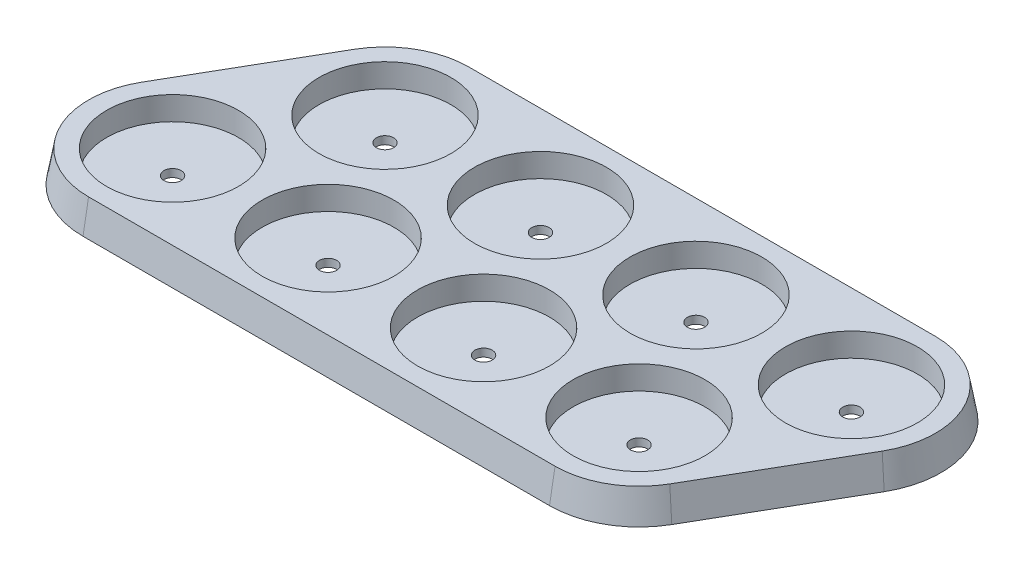
ISO-10303-21;
HEADER;
FILE_DESCRIPTION(('STEP AP214'),'2;1');
FILE_NAME('part.step','',(''),(''),'','','');
FILE_SCHEMA(('AUTOMOTIVE_DESIGN { 1 0 10303 214 1 1 1 1 }'));
ENDSEC;
DATA;
#1=APPLICATION_CONTEXT('core data for automotive mechanical design processes');
#2=APPLICATION_PROTOCOL_DEFINITION('international standard','automotive_design',2000,#1);
#3=PRODUCT_CONTEXT('',#1,'mechanical');
#4=PRODUCT('Part','Part','',(#3));
#5=PRODUCT_RELATED_PRODUCT_CATEGORY('part','',(#4));
#6=PRODUCT_DEFINITION_FORMATION('','',#4);
#7=PRODUCT_DEFINITION_CONTEXT('part definition',#1,'design');
#8=PRODUCT_DEFINITION('design','',#6,#7);
#9=PRODUCT_DEFINITION_SHAPE('','',#8);
#10=(LENGTH_UNIT() NAMED_UNIT(*) SI_UNIT(.MILLI.,.METRE.));
#11=(NAMED_UNIT(*) PLANE_ANGLE_UNIT() SI_UNIT($,.RADIAN.));
#12=(NAMED_UNIT(*) SI_UNIT($,.STERADIAN.) SOLID_ANGLE_UNIT());
#13=UNCERTAINTY_MEASURE_WITH_UNIT(LENGTH_MEASURE(1.E-05),#10,'distance_accuracy_value','');
#14=(GEOMETRIC_REPRESENTATION_CONTEXT(3) GLOBAL_UNCERTAINTY_ASSIGNED_CONTEXT((#13)) GLOBAL_UNIT_ASSIGNED_CONTEXT((#10,
#11,#12)) REPRESENTATION_CONTEXT('',''));
#15=CARTESIAN_POINT('',(0.,0.,0.));
#16=DIRECTION('',(0.,0.,1.));
#17=DIRECTION('',(1.,0.,0.));
#18=AXIS2_PLACEMENT_3D('',#15,#16,#17);
#19=CARTESIAN_POINT('',(-9.90000000000008,0.,17.1473029949318));
#20=DIRECTION('',(0.,1.,0.));
#21=DIRECTION('',(0.,0.,1.));
#22=AXIS2_PLACEMENT_3D('',#19,#20,#21);
#23=CYLINDRICAL_SURFACE('',#22,1.1);
#24=CARTESIAN_POINT('',(-9.90000000000008,0.,17.1473029949318));
#25=DIRECTION('',(0.,1.,0.));
#26=DIRECTION('',(0.,0.,1.));
#27=AXIS2_PLACEMENT_3D('',#24,#25,#26);
#28=CIRCLE('',#27,1.1);
#29=CARTESIAN_POINT('',(-9.90000000000008,0.,18.2473029949318));
#30=VERTEX_POINT('',#29);
#31=EDGE_CURVE('E204',#30,#30,#28,.T.);
#32=ORIENTED_EDGE('',*,*,#31,.F.);
#33=EDGE_LOOP('',(#32));
#34=FACE_BOUND('',#33,.T.);
#35=CARTESIAN_POINT('',(-9.90000000000008,1.,17.1473029949318));
#36=DIRECTION('',(0.,1.,0.));
#37=DIRECTION('',(0.,0.,1.));
#38=AXIS2_PLACEMENT_3D('',#35,#36,#37);
#39=CIRCLE('',#38,1.1);
#40=CARTESIAN_POINT('',(-9.90000000000008,1.,18.2473029949318));
#41=VERTEX_POINT('',#40);
#42=EDGE_CURVE('E717',#41,#41,#39,.T.);
#43=ORIENTED_EDGE('',*,*,#42,.T.);
#44=EDGE_LOOP('',(#43));
#45=FACE_BOUND('',#44,.T.);
#46=ADVANCED_FACE('F116',(#34,#45),#23,.F.);
#47=CARTESIAN_POINT('',(-19.7999999999998,0.,0.));
#48=DIRECTION('',(0.,1.,0.));
#49=DIRECTION('',(0.,0.,1.));
#50=AXIS2_PLACEMENT_3D('',#47,#48,#49);
#51=CYLINDRICAL_SURFACE('',#50,1.1);
#52=CARTESIAN_POINT('',(-19.7999999999998,0.,0.));
#53=DIRECTION('',(0.,1.,0.));
#54=DIRECTION('',(0.,0.,1.));
#55=AXIS2_PLACEMENT_3D('',#52,#53,#54);
#56=CIRCLE('',#55,1.1);
#57=CARTESIAN_POINT('',(-19.7999999999998,0.,1.1));
#58=VERTEX_POINT('',#57);
#59=EDGE_CURVE('E749',#58,#58,#56,.T.);
#60=ORIENTED_EDGE('',*,*,#59,.F.);
#61=EDGE_LOOP('',(#60));
#62=FACE_BOUND('',#61,.T.);
#63=CARTESIAN_POINT('',(-19.7999999999998,1.,0.));
#64=DIRECTION('',(0.,1.,0.));
#65=DIRECTION('',(0.,0.,1.));
#66=AXIS2_PLACEMENT_3D('',#63,#64,#65);
#67=CIRCLE('',#66,1.1);
#68=CARTESIAN_POINT('',(-19.7999999999998,1.,1.1));
#69=VERTEX_POINT('',#68);
#70=EDGE_CURVE('E739',#69,#69,#67,.T.);
#71=ORIENTED_EDGE('',*,*,#70,.T.);
#72=EDGE_LOOP('',(#71));
#73=FACE_BOUND('',#72,.T.);
#74=ADVANCED_FACE('F299',(#62,#73),#51,.F.);
#75=CARTESIAN_POINT('',(-69.3000000000001,0.,17.1473029949314));
#76=DIRECTION('',(0.,1.,0.));
#77=DIRECTION('',(0.,0.,1.));
#78=AXIS2_PLACEMENT_3D('',#75,#76,#77);
#79=CYLINDRICAL_SURFACE('',#78,1.09999999999992);
#80=CARTESIAN_POINT('',(-69.3000000000001,0.,17.1473029949314));
#81=DIRECTION('',(0.,1.,0.));
#82=DIRECTION('',(0.,0.,1.));
#83=AXIS2_PLACEMENT_3D('',#80,#81,#82);
#84=CIRCLE('',#83,1.09999999999992);
#85=CARTESIAN_POINT('',(-69.3000000000001,0.,18.2473029949313));
#86=VERTEX_POINT('',#85);
#87=EDGE_CURVE('E758',#86,#86,#84,.T.);
#88=ORIENTED_EDGE('',*,*,#87,.F.);
#89=EDGE_LOOP('',(#88));
#90=FACE_BOUND('',#89,.T.);
#91=CARTESIAN_POINT('',(-69.3000000000001,1.,17.1473029949314));
#92=DIRECTION('',(0.,1.,0.));
#93=DIRECTION('',(0.,0.,1.));
#94=AXIS2_PLACEMENT_3D('',#91,#92,#93);
#95=CIRCLE('',#94,1.09999999999992);
#96=CARTESIAN_POINT('',(-69.3000000000001,1.,18.2473029949313));
#97=VERTEX_POINT('',#96);
#98=EDGE_CURVE('E839',#97,#97,#95,.T.);
#99=ORIENTED_EDGE('',*,*,#98,.T.);
#100=EDGE_LOOP('',(#99));
#101=FACE_BOUND('',#100,.T.);
#102=ADVANCED_FACE('F305',(#90,#101),#79,.F.);
#103=CARTESIAN_POINT('',(-59.3999999999999,0.,-5.575290229487E-13));
#104=DIRECTION('',(0.,1.,0.));
#105=DIRECTION('',(0.,0.,1.));
#106=AXIS2_PLACEMENT_3D('',#103,#104,#105);
#107=CYLINDRICAL_SURFACE('',#106,1.09999999999986);
#108=CARTESIAN_POINT('',(-59.3999999999999,0.,-5.575290229487E-13));
#109=DIRECTION('',(0.,1.,0.));
#110=DIRECTION('',(0.,0.,1.));
#111=AXIS2_PLACEMENT_3D('',#108,#109,#110);
#112=CIRCLE('',#111,1.09999999999986);
#113=CARTESIAN_POINT('',(-59.3999999999999,0.,1.0999999999993));
#114=VERTEX_POINT('',#113);
#115=EDGE_CURVE('E753',#114,#114,#112,.T.);
#116=ORIENTED_EDGE('',*,*,#115,.F.);
#117=EDGE_LOOP('',(#116));
#118=FACE_BOUND('',#117,.T.);
#119=CARTESIAN_POINT('',(-59.3999999999999,1.,-5.575290229487E-13));
#120=DIRECTION('',(0.,1.,0.));
#121=DIRECTION('',(0.,0.,1.));
#122=AXIS2_PLACEMENT_3D('',#119,#120,#121);
#123=CIRCLE('',#122,1.09999999999986);
#124=CARTESIAN_POINT('',(-59.3999999999999,1.,1.0999999999993));
#125=VERTEX_POINT('',#124);
#126=EDGE_CURVE('E801',#125,#125,#123,.T.);
#127=ORIENTED_EDGE('',*,*,#126,.T.);
#128=EDGE_LOOP('',(#127));
#129=FACE_BOUND('',#128,.T.);
#130=ADVANCED_FACE('F530',(#118,#129),#107,.F.);
#131=CARTESIAN_POINT('',(-49.4999999999999,0.,17.1473029949314));
#132=DIRECTION('',(0.,1.,0.));
#133=DIRECTION('',(0.,0.,1.));
#134=AXIS2_PLACEMENT_3D('',#131,#132,#133);
#135=CYLINDRICAL_SURFACE('',#134,1.09999999999995);
#136=CARTESIAN_POINT('',(-49.4999999999999,0.,17.1473029949314));
#137=DIRECTION('',(0.,1.,0.));
#138=DIRECTION('',(0.,0.,1.));
#139=AXIS2_PLACEMENT_3D('',#136,#137,#138);
#140=CIRCLE('',#139,1.09999999999995);
#141=CARTESIAN_POINT('',(-49.4999999999999,0.,18.2473029949314));
#142=VERTEX_POINT('',#141);
#143=EDGE_CURVE('E757',#142,#142,#140,.T.);
#144=ORIENTED_EDGE('',*,*,#143,.F.);
#145=EDGE_LOOP('',(#144));
#146=FACE_BOUND('',#145,.T.);
#147=CARTESIAN_POINT('',(-49.4999999999999,1.,17.1473029949314));
#148=DIRECTION('',(0.,1.,0.));
#149=DIRECTION('',(0.,0.,1.));
#150=AXIS2_PLACEMENT_3D('',#147,#148,#149);
#151=CIRCLE('',#150,1.09999999999995);
#152=CARTESIAN_POINT('',(-49.4999999999999,1.,18.2473029949314));
#153=VERTEX_POINT('',#152);
#154=EDGE_CURVE('E782',#153,#153,#151,.T.);
#155=ORIENTED_EDGE('',*,*,#154,.T.);
#156=EDGE_LOOP('',(#155));
#157=FACE_BOUND('',#156,.T.);
#158=ADVANCED_FACE('F312',(#146,#157),#135,.F.);
#159=CARTESIAN_POINT('',(-39.5999999999998,0.,-3.59412499761901E-13));
#160=DIRECTION('',(0.,1.,0.));
#161=DIRECTION('',(0.,0.,1.));
#162=AXIS2_PLACEMENT_3D('',#159,#160,#161);
#163=CYLINDRICAL_SURFACE('',#162,1.09999999999995);
#164=CARTESIAN_POINT('',(-39.5999999999998,0.,-3.59412499761901E-13));
#165=DIRECTION('',(0.,1.,0.));
#166=DIRECTION('',(0.,0.,1.));
#167=AXIS2_PLACEMENT_3D('',#164,#165,#166);
#168=CIRCLE('',#167,1.09999999999995);
#169=CARTESIAN_POINT('',(-39.5999999999998,0.,1.09999999999959));
#170=VERTEX_POINT('',#169);
#171=EDGE_CURVE('E771',#170,#170,#168,.T.);
#172=ORIENTED_EDGE('',*,*,#171,.F.);
#173=EDGE_LOOP('',(#172));
#174=FACE_BOUND('',#173,.T.);
#175=CARTESIAN_POINT('',(-39.5999999999998,1.,-3.59412499761901E-13));
#176=DIRECTION('',(0.,1.,0.));
#177=DIRECTION('',(0.,0.,1.));
#178=AXIS2_PLACEMENT_3D('',#175,#176,#177);
#179=CIRCLE('',#178,1.09999999999995);
#180=CARTESIAN_POINT('',(-39.5999999999998,1.,1.09999999999959));
#181=VERTEX_POINT('',#180);
#182=EDGE_CURVE('E727',#181,#181,#179,.T.);
#183=ORIENTED_EDGE('',*,*,#182,.T.);
#184=EDGE_LOOP('',(#183));
#185=FACE_BOUND('',#184,.T.);
#186=ADVANCED_FACE('F547',(#174,#185),#163,.F.);
#187=CARTESIAN_POINT('',(-29.7,0.,17.1473029949318));
#188=DIRECTION('',(0.,1.,0.));
#189=DIRECTION('',(0.,0.,1.));
#190=AXIS2_PLACEMENT_3D('',#187,#188,#189);
#191=CYLINDRICAL_SURFACE('',#190,1.10000000000002);
#192=CARTESIAN_POINT('',(-29.7,0.,17.1473029949318));
#193=DIRECTION('',(0.,1.,0.));
#194=DIRECTION('',(0.,0.,1.));
#195=AXIS2_PLACEMENT_3D('',#192,#193,#194);
#196=CIRCLE('',#195,1.10000000000002);
#197=CARTESIAN_POINT('',(-29.7,0.,18.2473029949318));
#198=VERTEX_POINT('',#197);
#199=EDGE_CURVE('E767',#198,#198,#196,.T.);
#200=ORIENTED_EDGE('',*,*,#199,.F.);
#201=EDGE_LOOP('',(#200));
#202=FACE_BOUND('',#201,.T.);
#203=CARTESIAN_POINT('',(-29.7,1.,17.1473029949318));
#204=DIRECTION('',(0.,1.,0.));
#205=DIRECTION('',(0.,0.,1.));
#206=AXIS2_PLACEMENT_3D('',#203,#204,#205);
#207=CIRCLE('',#206,1.10000000000002);
#208=CARTESIAN_POINT('',(-29.7,1.,18.2473029949318));
#209=VERTEX_POINT('',#208);
#210=EDGE_CURVE('E719',#209,#209,#207,.T.);
#211=ORIENTED_EDGE('',*,*,#210,.T.);
#212=EDGE_LOOP('',(#211));
#213=FACE_BOUND('',#212,.T.);
#214=ADVANCED_FACE('F555',(#202,#213),#191,.F.);
#215=CARTESIAN_POINT('',(0.,0.,0.));
#216=DIRECTION('',(0.,1.,0.));
#217=DIRECTION('',(0.,0.,1.));
#218=AXIS2_PLACEMENT_3D('',#215,#216,#217);
#219=CYLINDRICAL_SURFACE('',#218,1.1);
#220=CARTESIAN_POINT('',(0.,0.,0.));
#221=DIRECTION('',(0.,1.,0.));
#222=DIRECTION('',(0.,0.,1.));
#223=AXIS2_PLACEMENT_3D('',#220,#221,#222);
#224=CIRCLE('',#223,1.1);
#225=CARTESIAN_POINT('',(0.,0.,1.1));
#226=VERTEX_POINT('',#225);
#227=EDGE_CURVE('E208',#226,#226,#224,.T.);
#228=ORIENTED_EDGE('',*,*,#227,.F.);
#229=EDGE_LOOP('',(#228));
#230=FACE_BOUND('',#229,.T.);
#231=CARTESIAN_POINT('',(0.,1.,0.));
#232=DIRECTION('',(0.,1.,0.));
#233=DIRECTION('',(0.,0.,1.));
#234=AXIS2_PLACEMENT_3D('',#231,#232,#233);
#235=CIRCLE('',#234,1.1);
#236=CARTESIAN_POINT('',(0.,1.,1.1));
#237=VERTEX_POINT('',#236);
#238=EDGE_CURVE('E698',#237,#237,#235,.T.);
#239=ORIENTED_EDGE('',*,*,#238,.T.);
#240=EDGE_LOOP('',(#239));
#241=FACE_BOUND('',#240,.T.);
#242=ADVANCED_FACE('F326',(#230,#241),#219,.F.);
#243=CARTESIAN_POINT('',(-9.90000000000008,0.,17.1473029949318));
#244=DIRECTION('',(0.,-1.,0.));
#245=DIRECTION('',(0.,0.,1.));
#246=AXIS2_PLACEMENT_3D('',#243,#244,#245);
#247=CONICAL_SURFACE('',#246,11.4,0.174532925199433);
#248=CARTESIAN_POINT('',(-9.90000000000008,0.,17.1473029949318));
#249=DIRECTION('',(0.,1.,0.));
#250=DIRECTION('',(0.,0.,1.));
#251=AXIS2_PLACEMENT_3D('',#248,#249,#250);
#252=CIRCLE('',#251,11.4);
#253=CARTESIAN_POINT('',(-9.90000000000008,0.,28.5473029949318));
#254=VERTEX_POINT('',#253);
#255=CARTESIAN_POINT('',(-0.0273103968575087,0.,22.8473029949319));
#256=VERTEX_POINT('',#255);
#257=EDGE_CURVE('E229',#254,#256,#252,.T.);
#258=ORIENTED_EDGE('',*,*,#257,.T.);
#259=DIRECTION('',(0.150383733180435,-0.984807753012208,0.0868240888334661));
#260=VECTOR('',#259,1.);
#261=CARTESIAN_POINT('',(-0.0273103968575079,0.,22.8473029949319));
#262=LINE('',#261,#260);
#263=CARTESIAN_POINT('',(-0.638124975522065,4.,22.494649033515));
#264=VERTEX_POINT('',#263);
#265=EDGE_CURVE('E201',#264,#256,#262,.T.);
#266=ORIENTED_EDGE('',*,*,#265,.F.);
#267=CARTESIAN_POINT('',(-9.90000000000008,4.,17.1473029949318));
#268=DIRECTION('',(0.,1.,0.));
#269=DIRECTION('',(0.,0.,1.));
#270=AXIS2_PLACEMENT_3D('',#267,#268,#269);
#271=CIRCLE('',#270,10.6946920771661);
#272=CARTESIAN_POINT('',(-9.90000000000008,4.,27.841995072098));
#273=VERTEX_POINT('',#272);
#274=EDGE_CURVE('E120',#273,#264,#271,.T.);
#275=ORIENTED_EDGE('',*,*,#274,.F.);
#276=DIRECTION('',(0.,-0.984807753012208,0.173648177666931));
#277=VECTOR('',#276,1.);
#278=CARTESIAN_POINT('',(-9.90000000000008,0.,28.5473029949318));
#279=LINE('',#278,#277);
#280=EDGE_CURVE('E141',#273,#254,#279,.T.);
#281=ORIENTED_EDGE('',*,*,#280,.T.);
#282=EDGE_LOOP('',(#258,#266,#275,#281));
#283=FACE_BOUND('',#282,.T.);
#284=ADVANCED_FACE('F323',(#283),#247,.T.);
#285=CARTESIAN_POINT('',(9.87268960314258,0.,5.70000000000005));
#286=DIRECTION('',(0.852868531952441,0.173648177666931,0.492403876506108));
#287=DIRECTION('',(0.500000000000004,0.,-0.866025403784436));
#288=AXIS2_PLACEMENT_3D('',#285,#286,#287);
#289=PLANE('',#288);
#290=DIRECTION('',(-0.500000000000004,0.,0.866025403784436));
#291=VECTOR('',#290,1.);
#292=CARTESIAN_POINT('',(9.87268960314258,0.,5.70000000000005));
#293=LINE('',#292,#291);
#294=CARTESIAN_POINT('',(9.87268960314258,0.,5.70000000000005));
#295=VERTEX_POINT('',#294);
#296=EDGE_CURVE('E195',#295,#256,#293,.T.);
#297=ORIENTED_EDGE('',*,*,#296,.F.);
#298=DIRECTION('',(0.150383733180435,-0.984807753012208,0.0868240888334661));
#299=VECTOR('',#298,1.);
#300=CARTESIAN_POINT('',(9.87268960314258,0.,5.70000000000004));
#301=LINE('',#300,#299);
#302=CARTESIAN_POINT('',(9.26187502447802,4.,5.34734603858311));
#303=VERTEX_POINT('',#302);
#304=EDGE_CURVE('E12',#303,#295,#301,.T.);
#305=ORIENTED_EDGE('',*,*,#304,.F.);
#306=DIRECTION('',(-0.500000000000004,0.,0.866025403784436));
#307=VECTOR('',#306,1.);
#308=CARTESIAN_POINT('',(9.26187502447802,4.,5.34734603858312));
#309=LINE('',#308,#307);
#310=EDGE_CURVE('E231',#303,#264,#309,.T.);
#311=ORIENTED_EDGE('',*,*,#310,.T.);
#312=ORIENTED_EDGE('',*,*,#265,.T.);
#313=EDGE_LOOP('',(#297,#305,#311,#312));
#314=FACE_BOUND('',#313,.T.);
#315=ADVANCED_FACE('F200',(#314),#289,.T.);
#316=CARTESIAN_POINT('',(0.,0.,0.));
#317=DIRECTION('',(0.,-1.,0.));
#318=DIRECTION('',(0.,0.,1.));
#319=AXIS2_PLACEMENT_3D('',#316,#317,#318);
#320=CONICAL_SURFACE('',#319,11.4,0.174532925199433);
#321=CARTESIAN_POINT('',(0.,0.,0.));
#322=DIRECTION('',(0.,1.,0.));
#323=DIRECTION('',(0.,0.,1.));
#324=AXIS2_PLACEMENT_3D('',#321,#322,#323);
#325=CIRCLE('',#324,11.4);
#326=CARTESIAN_POINT('',(0.,0.,-11.4));
#327=VERTEX_POINT('',#326);
#328=EDGE_CURVE('E184',#295,#327,#325,.T.);
#329=ORIENTED_EDGE('',*,*,#328,.T.);
#330=DIRECTION('',(0.,-0.984807753012208,-0.173648177666931));
#331=VECTOR('',#330,1.);
#332=CARTESIAN_POINT('',(0.,0.,-11.4));
#333=LINE('',#332,#331);
#334=CARTESIAN_POINT('',(0.,4.,-10.6946920771661));
#335=VERTEX_POINT('',#334);
#336=EDGE_CURVE('E126',#335,#327,#333,.T.);
#337=ORIENTED_EDGE('',*,*,#336,.F.);
#338=CARTESIAN_POINT('',(0.,4.,0.));
#339=DIRECTION('',(0.,1.,0.));
#340=DIRECTION('',(0.,0.,1.));
#341=AXIS2_PLACEMENT_3D('',#338,#339,#340);
#342=CIRCLE('',#341,10.6946920771661);
#343=EDGE_CURVE('E186',#303,#335,#342,.T.);
#344=ORIENTED_EDGE('',*,*,#343,.F.);
#345=ORIENTED_EDGE('',*,*,#304,.T.);
#346=EDGE_LOOP('',(#329,#337,#344,#345));
#347=FACE_BOUND('',#346,.T.);
#348=ADVANCED_FACE('F118',(#347),#320,.T.);
#349=CARTESIAN_POINT('',(1.13860940877749E-13,0.,-11.4));
#350=DIRECTION('',(0.,0.173648177666931,-0.984807753012208));
#351=DIRECTION('',(0.,0.984807753012208,0.173648177666931));
#352=AXIS2_PLACEMENT_3D('',#349,#350,#351);
#353=PLANE('',#352);
#354=DIRECTION('',(-1.,0.,0.));
#355=VECTOR('',#354,1.);
#356=CARTESIAN_POINT('',(1.13860940877749E-13,0.,-11.4));
#357=LINE('',#356,#355);
#358=CARTESIAN_POINT('',(-59.3999999999997,0.,-11.4000000000005));
#359=VERTEX_POINT('',#358);
#360=EDGE_CURVE('E197',#327,#359,#357,.T.);
#361=ORIENTED_EDGE('',*,*,#360,.T.);
#362=DIRECTION('',(0.,-0.984807753012208,-0.173648177666931));
#363=VECTOR('',#362,1.);
#364=CARTESIAN_POINT('',(-59.3999999999997,0.,-11.4000000000004));
#365=LINE('',#364,#363);
#366=CARTESIAN_POINT('',(-59.3999999999997,4.,-10.6946920771666));
#367=VERTEX_POINT('',#366);
#368=EDGE_CURVE('E247',#367,#359,#365,.T.);
#369=ORIENTED_EDGE('',*,*,#368,.F.);
#370=DIRECTION('',(1.,0.,0.));
#371=VECTOR('',#370,1.);
#372=CARTESIAN_POINT('',(1.06816465114381E-13,4.,-10.6946920771661));
#373=LINE('',#372,#371);
#374=EDGE_CURVE('E257',#335,#367,#373,.F.);
#375=ORIENTED_EDGE('',*,*,#374,.F.);
#376=ORIENTED_EDGE('',*,*,#336,.T.);
#377=EDGE_LOOP('',(#361,#369,#375,#376));
#378=FACE_BOUND('',#377,.T.);
#379=ADVANCED_FACE('F291',(#378),#353,.T.);
#380=CARTESIAN_POINT('',(-59.3999999999999,0.,-5.575290229487E-13));
#381=DIRECTION('',(0.,-1.,0.));
#382=DIRECTION('',(0.,0.,1.));
#383=AXIS2_PLACEMENT_3D('',#380,#381,#382);
#384=CONICAL_SURFACE('',#383,11.3999999999999,0.174532925199433);
#385=CARTESIAN_POINT('',(-59.3999999999999,0.,-5.575290229487E-13));
#386=DIRECTION('',(0.,1.,0.));
#387=DIRECTION('',(0.,0.,1.));
#388=AXIS2_PLACEMENT_3D('',#385,#386,#387);
#389=CIRCLE('',#388,11.3999999999999);
#390=CARTESIAN_POINT('',(-69.2726896031423,0.,-5.70000000000064));
#391=VERTEX_POINT('',#390);
#392=EDGE_CURVE('E214',#359,#391,#389,.T.);
#393=ORIENTED_EDGE('',*,*,#392,.T.);
#394=DIRECTION('',(-0.150383733180435,-0.984807753012208,-0.0868240888334672));
#395=VECTOR('',#394,1.);
#396=CARTESIAN_POINT('',(-69.2726896031424,0.,-5.70000000000067));
#397=LINE('',#396,#395);
#398=CARTESIAN_POINT('',(-68.6618750244778,4.,-5.34734603858373));
#399=VERTEX_POINT('',#398);
#400=EDGE_CURVE('E244',#399,#391,#397,.T.);
#401=ORIENTED_EDGE('',*,*,#400,.F.);
#402=CARTESIAN_POINT('',(-59.3999999999999,4.,-5.575290229487E-13));
#403=DIRECTION('',(0.,1.,0.));
#404=DIRECTION('',(0.,0.,1.));
#405=AXIS2_PLACEMENT_3D('',#402,#403,#404);
#406=CIRCLE('',#405,10.694692077166);
#407=EDGE_CURVE('E260',#367,#399,#406,.T.);
#408=ORIENTED_EDGE('',*,*,#407,.F.);
#409=ORIENTED_EDGE('',*,*,#368,.T.);
#410=EDGE_LOOP('',(#393,#401,#408,#409));
#411=FACE_BOUND('',#410,.T.);
#412=ADVANCED_FACE('F287',(#411),#384,.T.);
#413=CARTESIAN_POINT('',(-54.422689603142,0.,-31.4209544923984));
#414=DIRECTION('',(-0.852868531952437,0.173648177666931,-0.492403876506115));
#415=DIRECTION('',(-0.500000000000011,0.,0.866025403784432));
#416=AXIS2_PLACEMENT_3D('',#413,#414,#415);
#417=PLANE('',#416);
#418=DIRECTION('',(0.500000000000011,0.,-0.866025403784432));
#419=VECTOR('',#418,1.);
#420=CARTESIAN_POINT('',(-54.422689603142,0.,-31.4209544923984));
#421=LINE('',#420,#419);
#422=CARTESIAN_POINT('',(-79.1726896031426,0.,11.4473029949312));
#423=VERTEX_POINT('',#422);
#424=EDGE_CURVE('E218',#423,#391,#421,.T.);
#425=ORIENTED_EDGE('',*,*,#424,.F.);
#426=DIRECTION('',(-0.150383733180435,-0.984807753012208,-0.0868240888334672));
#427=VECTOR('',#426,1.);
#428=CARTESIAN_POINT('',(-79.1726896031425,0.,11.4473029949313));
#429=LINE('',#428,#427);
#430=CARTESIAN_POINT('',(-78.561875024478,4.,11.7999569563482));
#431=VERTEX_POINT('',#430);
#432=EDGE_CURVE('E241',#431,#423,#429,.T.);
#433=ORIENTED_EDGE('',*,*,#432,.F.);
#434=DIRECTION('',(0.500000000000011,0.,-0.866025403784432));
#435=VECTOR('',#434,1.);
#436=CARTESIAN_POINT('',(-53.8118750244775,4.,-31.0683005309815));
#437=LINE('',#436,#435);
#438=EDGE_CURVE('E263',#431,#399,#437,.T.);
#439=ORIENTED_EDGE('',*,*,#438,.T.);
#440=ORIENTED_EDGE('',*,*,#400,.T.);
#441=EDGE_LOOP('',(#425,#433,#439,#440));
#442=FACE_BOUND('',#441,.T.);
#443=ADVANCED_FACE('F283',(#442),#417,.T.);
#444=CARTESIAN_POINT('',(-69.3000000000001,0.,17.1473029949314));
#445=DIRECTION('',(0.,-1.,0.));
#446=DIRECTION('',(0.,0.,1.));
#447=AXIS2_PLACEMENT_3D('',#444,#445,#446);
#448=CONICAL_SURFACE('',#447,11.3999999999999,0.174532925199433);
#449=CARTESIAN_POINT('',(-69.3000000000001,0.,17.1473029949314));
#450=DIRECTION('',(0.,1.,0.));
#451=DIRECTION('',(0.,0.,1.));
#452=AXIS2_PLACEMENT_3D('',#449,#450,#451);
#453=CIRCLE('',#452,11.3999999999999);
#454=CARTESIAN_POINT('',(-69.3000000000001,0.,28.5473029949313));
#455=VERTEX_POINT('',#454);
#456=EDGE_CURVE('E222',#423,#455,#453,.T.);
#457=ORIENTED_EDGE('',*,*,#456,.T.);
#458=DIRECTION('',(0.,-0.984807753012208,0.173648177666931));
#459=VECTOR('',#458,1.);
#460=CARTESIAN_POINT('',(-69.3000000000001,0.,28.5473029949314));
#461=LINE('',#460,#459);
#462=CARTESIAN_POINT('',(-69.3000000000001,4.,27.8419950720975));
#463=VERTEX_POINT('',#462);
#464=EDGE_CURVE('E237',#463,#455,#461,.T.);
#465=ORIENTED_EDGE('',*,*,#464,.F.);
#466=CARTESIAN_POINT('',(-69.3000000000001,4.,17.1473029949314));
#467=DIRECTION('',(0.,1.,0.));
#468=DIRECTION('',(0.,0.,1.));
#469=AXIS2_PLACEMENT_3D('',#466,#467,#468);
#470=CIRCLE('',#469,10.6946920771661);
#471=EDGE_CURVE('E267',#431,#463,#470,.T.);
#472=ORIENTED_EDGE('',*,*,#471,.F.);
#473=ORIENTED_EDGE('',*,*,#432,.T.);
#474=EDGE_LOOP('',(#457,#465,#472,#473));
#475=FACE_BOUND('',#474,.T.);
#476=ADVANCED_FACE('F279',(#475),#448,.T.);
#477=CARTESIAN_POINT('',(0.,0.,28.5473029949314));
#478=DIRECTION('',(0.,0.173648177666931,0.984807753012208));
#479=DIRECTION('',(0.,-0.984807753012208,0.173648177666931));
#480=AXIS2_PLACEMENT_3D('',#477,#478,#479);
#481=PLANE('',#480);
#482=DIRECTION('',(-1.,0.,0.));
#483=VECTOR('',#482,1.);
#484=CARTESIAN_POINT('',(0.,4.,27.8419950720975));
#485=LINE('',#484,#483);
#486=EDGE_CURVE('E270',#273,#463,#485,.T.);
#487=ORIENTED_EDGE('',*,*,#486,.T.);
#488=ORIENTED_EDGE('',*,*,#464,.T.);
#489=DIRECTION('',(-1.,0.,0.));
#490=VECTOR('',#489,1.);
#491=CARTESIAN_POINT('',(0.,0.,28.5473029949314));
#492=LINE('',#491,#490);
#493=EDGE_CURVE('E226',#254,#455,#492,.T.);
#494=ORIENTED_EDGE('',*,*,#493,.F.);
#495=ORIENTED_EDGE('',*,*,#280,.F.);
#496=EDGE_LOOP('',(#487,#488,#494,#495));
#497=FACE_BOUND('',#496,.T.);
#498=ADVANCED_FACE('F273',(#497),#481,.T.);
#499=CARTESIAN_POINT('',(0.,0.,0.));
#500=DIRECTION('',(0.,1.,0.));
#501=DIRECTION('',(0.,0.,1.));
#502=AXIS2_PLACEMENT_3D('',#499,#500,#501);
#503=PLANE('',#502);
#504=ORIENTED_EDGE('',*,*,#227,.T.);
#505=EDGE_LOOP('',(#504));
#506=FACE_BOUND('',#505,.T.);
#507=ORIENTED_EDGE('',*,*,#199,.T.);
#508=EDGE_LOOP('',(#507));
#509=FACE_BOUND('',#508,.T.);
#510=ORIENTED_EDGE('',*,*,#171,.T.);
#511=EDGE_LOOP('',(#510));
#512=FACE_BOUND('',#511,.T.);
#513=ORIENTED_EDGE('',*,*,#143,.T.);
#514=EDGE_LOOP('',(#513));
#515=FACE_BOUND('',#514,.T.);
#516=ORIENTED_EDGE('',*,*,#115,.T.);
#517=EDGE_LOOP('',(#516));
#518=FACE_BOUND('',#517,.T.);
#519=ORIENTED_EDGE('',*,*,#87,.T.);
#520=EDGE_LOOP('',(#519));
#521=FACE_BOUND('',#520,.T.);
#522=ORIENTED_EDGE('',*,*,#59,.T.);
#523=EDGE_LOOP('',(#522));
#524=FACE_BOUND('',#523,.T.);
#525=ORIENTED_EDGE('',*,*,#31,.T.);
#526=EDGE_LOOP('',(#525));
#527=FACE_BOUND('',#526,.T.);
#528=ORIENTED_EDGE('',*,*,#493,.T.);
#529=ORIENTED_EDGE('',*,*,#456,.F.);
#530=ORIENTED_EDGE('',*,*,#424,.T.);
#531=ORIENTED_EDGE('',*,*,#392,.F.);
#532=ORIENTED_EDGE('',*,*,#360,.F.);
#533=ORIENTED_EDGE('',*,*,#328,.F.);
#534=ORIENTED_EDGE('',*,*,#296,.T.);
#535=ORIENTED_EDGE('',*,*,#257,.F.);
#536=EDGE_LOOP('',(#528,#529,#530,#531,#532,#533,#534,#535));
#537=FACE_BOUND('',#536,.T.);
#538=ADVANCED_FACE('F193',(#506,#509,#512,#515,#518,#521,#524,#527,#537),#503,.F.);
#539=CARTESIAN_POINT('',(0.,4.,0.));
#540=DIRECTION('',(0.,1.,0.));
#541=DIRECTION('',(0.,0.,1.));
#542=AXIS2_PLACEMENT_3D('',#539,#540,#541);
#543=PLANE('',#542);
#544=CARTESIAN_POINT('',(-9.90000000000008,4.,17.1473029949318));
#545=DIRECTION('',(0.,1.,0.));
#546=DIRECTION('',(0.,0.,1.));
#547=AXIS2_PLACEMENT_3D('',#544,#545,#546);
#548=CIRCLE('',#547,8.4);
#549=CARTESIAN_POINT('',(-9.90000000000008,4.,25.5473029949318));
#550=VERTEX_POINT('',#549);
#551=EDGE_CURVE('E713',#550,#550,#548,.T.);
#552=ORIENTED_EDGE('',*,*,#551,.F.);
#553=EDGE_LOOP('',(#552));
#554=FACE_BOUND('',#553,.T.);
#555=CARTESIAN_POINT('',(0.,4.,0.));
#556=DIRECTION('',(0.,1.,0.));
#557=DIRECTION('',(0.,0.,1.));
#558=AXIS2_PLACEMENT_3D('',#555,#556,#557);
#559=CIRCLE('',#558,8.4);
#560=CARTESIAN_POINT('',(0.,4.,8.4));
#561=VERTEX_POINT('',#560);
#562=EDGE_CURVE('E700',#561,#561,#559,.T.);
#563=ORIENTED_EDGE('',*,*,#562,.F.);
#564=EDGE_LOOP('',(#563));
#565=FACE_BOUND('',#564,.T.);
#566=CARTESIAN_POINT('',(-29.7,4.,17.1473029949318));
#567=DIRECTION('',(0.,1.,0.));
#568=DIRECTION('',(0.,0.,1.));
#569=AXIS2_PLACEMENT_3D('',#566,#567,#568);
#570=CIRCLE('',#569,8.40000000000002);
#571=CARTESIAN_POINT('',(-29.7,4.,25.5473029949318));
#572=VERTEX_POINT('',#571);
#573=EDGE_CURVE('E709',#572,#572,#570,.T.);
#574=ORIENTED_EDGE('',*,*,#573,.F.);
#575=EDGE_LOOP('',(#574));
#576=FACE_BOUND('',#575,.T.);
#577=CARTESIAN_POINT('',(-39.5999999999998,4.,-3.59412499761901E-13));
#578=DIRECTION('',(0.,1.,0.));
#579=DIRECTION('',(0.,0.,1.));
#580=AXIS2_PLACEMENT_3D('',#577,#578,#579);
#581=CIRCLE('',#580,8.39999999999995);
#582=CARTESIAN_POINT('',(-39.5999999999998,4.,8.39999999999959));
#583=VERTEX_POINT('',#582);
#584=EDGE_CURVE('E731',#583,#583,#581,.T.);
#585=ORIENTED_EDGE('',*,*,#584,.F.);
#586=EDGE_LOOP('',(#585));
#587=FACE_BOUND('',#586,.T.);
#588=CARTESIAN_POINT('',(-69.3000000000001,4.,17.1473029949314));
#589=DIRECTION('',(0.,1.,0.));
#590=DIRECTION('',(0.,0.,1.));
#591=AXIS2_PLACEMENT_3D('',#588,#589,#590);
#592=CIRCLE('',#591,8.40000000000001);
#593=CARTESIAN_POINT('',(-69.3000000000001,4.,25.5473029949314));
#594=VERTEX_POINT('',#593);
#595=EDGE_CURVE('E796',#594,#594,#592,.T.);
#596=ORIENTED_EDGE('',*,*,#595,.F.);
#597=EDGE_LOOP('',(#596));
#598=FACE_BOUND('',#597,.T.);
#599=CARTESIAN_POINT('',(-59.3999999999999,4.,-5.575290229487E-13));
#600=DIRECTION('',(0.,1.,0.));
#601=DIRECTION('',(0.,0.,1.));
#602=AXIS2_PLACEMENT_3D('',#599,#600,#601);
#603=CIRCLE('',#602,8.39999999999986);
#604=CARTESIAN_POINT('',(-59.3999999999999,4.,8.39999999999931));
#605=VERTEX_POINT('',#604);
#606=EDGE_CURVE('E792',#605,#605,#603,.T.);
#607=ORIENTED_EDGE('',*,*,#606,.F.);
#608=EDGE_LOOP('',(#607));
#609=FACE_BOUND('',#608,.T.);
#610=CARTESIAN_POINT('',(-49.4999999999999,4.,17.1473029949314));
#611=DIRECTION('',(0.,1.,0.));
#612=DIRECTION('',(0.,0.,1.));
#613=AXIS2_PLACEMENT_3D('',#610,#611,#612);
#614=CIRCLE('',#613,8.39999999999995);
#615=CARTESIAN_POINT('',(-49.4999999999999,4.,25.5473029949314));
#616=VERTEX_POINT('',#615);
#617=EDGE_CURVE('E784',#616,#616,#614,.T.);
#618=ORIENTED_EDGE('',*,*,#617,.F.);
#619=EDGE_LOOP('',(#618));
#620=FACE_BOUND('',#619,.T.);
#621=CARTESIAN_POINT('',(-19.7999999999998,4.,0.));
#622=DIRECTION('',(0.,1.,0.));
#623=DIRECTION('',(0.,0.,1.));
#624=AXIS2_PLACEMENT_3D('',#621,#622,#623);
#625=CIRCLE('',#624,8.40000000000001);
#626=CARTESIAN_POINT('',(-19.7999999999998,4.,8.40000000000001));
#627=VERTEX_POINT('',#626);
#628=EDGE_CURVE('E743',#627,#627,#625,.T.);
#629=ORIENTED_EDGE('',*,*,#628,.F.);
#630=EDGE_LOOP('',(#629));
#631=FACE_BOUND('',#630,.T.);
#632=ORIENTED_EDGE('',*,*,#471,.T.);
#633=ORIENTED_EDGE('',*,*,#486,.F.);
#634=ORIENTED_EDGE('',*,*,#274,.T.);
#635=ORIENTED_EDGE('',*,*,#310,.F.);
#636=ORIENTED_EDGE('',*,*,#343,.T.);
#637=ORIENTED_EDGE('',*,*,#374,.T.);
#638=ORIENTED_EDGE('',*,*,#407,.T.);
#639=ORIENTED_EDGE('',*,*,#438,.F.);
#640=EDGE_LOOP('',(#632,#633,#634,#635,#636,#637,#638,#639));
#641=FACE_BOUND('',#640,.T.);
#642=ADVANCED_FACE('F277',(#554,#565,#576,#587,#598,#609,#620,#631,#641),#543,.T.);
#643=CARTESIAN_POINT('',(0.,1.,0.));
#644=DIRECTION('',(0.,1.,0.));
#645=DIRECTION('',(0.,0.,1.));
#646=AXIS2_PLACEMENT_3D('',#643,#644,#645);
#647=CYLINDRICAL_SURFACE('',#646,8.4);
#648=CARTESIAN_POINT('',(0.,1.,0.));
#649=DIRECTION('',(0.,1.,0.));
#650=DIRECTION('',(0.,0.,1.));
#651=AXIS2_PLACEMENT_3D('',#648,#649,#650);
#652=CIRCLE('',#651,8.4);
#653=CARTESIAN_POINT('',(0.,1.,8.4));
#654=VERTEX_POINT('',#653);
#655=EDGE_CURVE('E706',#654,#654,#652,.T.);
#656=ORIENTED_EDGE('',*,*,#655,.F.);
#657=EDGE_LOOP('',(#656));
#658=FACE_BOUND('',#657,.T.);
#659=ORIENTED_EDGE('',*,*,#562,.T.);
#660=EDGE_LOOP('',(#659));
#661=FACE_BOUND('',#660,.T.);
#662=ADVANCED_FACE('F316',(#658,#661),#647,.F.);
#663=CARTESIAN_POINT('',(0.,1.,0.));
#664=DIRECTION('',(0.,1.,0.));
#665=DIRECTION('',(0.,0.,1.));
#666=AXIS2_PLACEMENT_3D('',#663,#664,#665);
#667=PLANE('',#666);
#668=ORIENTED_EDGE('',*,*,#238,.F.);
#669=EDGE_LOOP('',(#668));
#670=FACE_BOUND('',#669,.T.);
#671=ORIENTED_EDGE('',*,*,#655,.T.);
#672=EDGE_LOOP('',(#671));
#673=FACE_BOUND('',#672,.T.);
#674=ADVANCED_FACE('F360',(#670,#673),#667,.T.);
#675=CARTESIAN_POINT('',(-29.7,1.,17.1473029949318));
#676=DIRECTION('',(0.,1.,0.));
#677=DIRECTION('',(0.,0.,1.));
#678=AXIS2_PLACEMENT_3D('',#675,#676,#677);
#679=CYLINDRICAL_SURFACE('',#678,8.40000000000002);
#680=CARTESIAN_POINT('',(-29.7,1.,17.1473029949318));
#681=DIRECTION('',(0.,1.,0.));
#682=DIRECTION('',(0.,0.,1.));
#683=AXIS2_PLACEMENT_3D('',#680,#681,#682);
#684=CIRCLE('',#683,8.40000000000002);
#685=CARTESIAN_POINT('',(-29.7,1.,25.5473029949318));
#686=VERTEX_POINT('',#685);
#687=EDGE_CURVE('E701',#686,#686,#684,.T.);
#688=ORIENTED_EDGE('',*,*,#687,.F.);
#689=EDGE_LOOP('',(#688));
#690=FACE_BOUND('',#689,.T.);
#691=ORIENTED_EDGE('',*,*,#573,.T.);
#692=EDGE_LOOP('',(#691));
#693=FACE_BOUND('',#692,.T.);
#694=ADVANCED_FACE('F368',(#690,#693),#679,.F.);
#695=CARTESIAN_POINT('',(-29.7,1.,17.1473029949318));
#696=DIRECTION('',(0.,1.,0.));
#697=DIRECTION('',(0.,0.,1.));
#698=AXIS2_PLACEMENT_3D('',#695,#696,#697);
#699=PLANE('',#698);
#700=ORIENTED_EDGE('',*,*,#210,.F.);
#701=EDGE_LOOP('',(#700));
#702=FACE_BOUND('',#701,.T.);
#703=ORIENTED_EDGE('',*,*,#687,.T.);
#704=EDGE_LOOP('',(#703));
#705=FACE_BOUND('',#704,.T.);
#706=ADVANCED_FACE('F376',(#702,#705),#699,.T.);
#707=CARTESIAN_POINT('',(-39.5999999999998,1.,-3.59412499761901E-13));
#708=DIRECTION('',(0.,1.,0.));
#709=DIRECTION('',(0.,0.,1.));
#710=AXIS2_PLACEMENT_3D('',#707,#708,#709);
#711=CYLINDRICAL_SURFACE('',#710,8.39999999999995);
#712=CARTESIAN_POINT('',(-39.5999999999998,1.,-3.59412499761901E-13));
#713=DIRECTION('',(0.,1.,0.));
#714=DIRECTION('',(0.,0.,1.));
#715=AXIS2_PLACEMENT_3D('',#712,#713,#714);
#716=CIRCLE('',#715,8.39999999999995);
#717=CARTESIAN_POINT('',(-39.5999999999998,1.,8.39999999999959));
#718=VERTEX_POINT('',#717);
#719=EDGE_CURVE('E722',#718,#718,#716,.T.);
#720=ORIENTED_EDGE('',*,*,#719,.F.);
#721=EDGE_LOOP('',(#720));
#722=FACE_BOUND('',#721,.T.);
#723=ORIENTED_EDGE('',*,*,#584,.T.);
#724=EDGE_LOOP('',(#723));
#725=FACE_BOUND('',#724,.T.);
#726=ADVANCED_FACE('F384',(#722,#725),#711,.F.);
#727=CARTESIAN_POINT('',(-39.5999999999998,1.,-3.59412499761901E-13));
#728=DIRECTION('',(0.,1.,0.));
#729=DIRECTION('',(0.,0.,1.));
#730=AXIS2_PLACEMENT_3D('',#727,#728,#729);
#731=PLANE('',#730);
#732=ORIENTED_EDGE('',*,*,#182,.F.);
#733=EDGE_LOOP('',(#732));
#734=FACE_BOUND('',#733,.T.);
#735=ORIENTED_EDGE('',*,*,#719,.T.);
#736=EDGE_LOOP('',(#735));
#737=FACE_BOUND('',#736,.T.);
#738=ADVANCED_FACE('F392',(#734,#737),#731,.T.);
#739=CARTESIAN_POINT('',(-49.4999999999999,1.,17.1473029949314));
#740=DIRECTION('',(0.,1.,0.));
#741=DIRECTION('',(0.,0.,1.));
#742=AXIS2_PLACEMENT_3D('',#739,#740,#741);
#743=CYLINDRICAL_SURFACE('',#742,8.39999999999995);
#744=CARTESIAN_POINT('',(-49.4999999999999,1.,17.1473029949314));
#745=DIRECTION('',(0.,1.,0.));
#746=DIRECTION('',(0.,0.,1.));
#747=AXIS2_PLACEMENT_3D('',#744,#745,#746);
#748=CIRCLE('',#747,8.39999999999995);
#749=CARTESIAN_POINT('',(-49.4999999999999,1.,25.5473029949314));
#750=VERTEX_POINT('',#749);
#751=EDGE_CURVE('E732',#750,#750,#748,.T.);
#752=ORIENTED_EDGE('',*,*,#751,.F.);
#753=EDGE_LOOP('',(#752));
#754=FACE_BOUND('',#753,.T.);
#755=ORIENTED_EDGE('',*,*,#617,.T.);
#756=EDGE_LOOP('',(#755));
#757=FACE_BOUND('',#756,.T.);
#758=ADVANCED_FACE('F400',(#754,#757),#743,.F.);
#759=CARTESIAN_POINT('',(-49.4999999999999,1.,17.1473029949314));
#760=DIRECTION('',(0.,1.,0.));
#761=DIRECTION('',(0.,0.,1.));
#762=AXIS2_PLACEMENT_3D('',#759,#760,#761);
#763=PLANE('',#762);
#764=ORIENTED_EDGE('',*,*,#154,.F.);
#765=EDGE_LOOP('',(#764));
#766=FACE_BOUND('',#765,.T.);
#767=ORIENTED_EDGE('',*,*,#751,.T.);
#768=EDGE_LOOP('',(#767));
#769=FACE_BOUND('',#768,.T.);
#770=ADVANCED_FACE('F408',(#766,#769),#763,.T.);
#771=CARTESIAN_POINT('',(-59.3999999999999,1.,-5.575290229487E-13));
#772=DIRECTION('',(0.,1.,0.));
#773=DIRECTION('',(0.,0.,1.));
#774=AXIS2_PLACEMENT_3D('',#771,#772,#773);
#775=CYLINDRICAL_SURFACE('',#774,8.39999999999986);
#776=CARTESIAN_POINT('',(-59.3999999999999,1.,-5.575290229487E-13));
#777=DIRECTION('',(0.,1.,0.));
#778=DIRECTION('',(0.,0.,1.));
#779=AXIS2_PLACEMENT_3D('',#776,#777,#778);
#780=CIRCLE('',#779,8.39999999999986);
#781=CARTESIAN_POINT('',(-59.3999999999999,1.,8.39999999999931));
#782=VERTEX_POINT('',#781);
#783=EDGE_CURVE('E785',#782,#782,#780,.T.);
#784=ORIENTED_EDGE('',*,*,#783,.F.);
#785=EDGE_LOOP('',(#784));
#786=FACE_BOUND('',#785,.T.);
#787=ORIENTED_EDGE('',*,*,#606,.T.);
#788=EDGE_LOOP('',(#787));
#789=FACE_BOUND('',#788,.T.);
#790=ADVANCED_FACE('F416',(#786,#789),#775,.F.);
#791=CARTESIAN_POINT('',(-59.3999999999999,1.,-5.575290229487E-13));
#792=DIRECTION('',(0.,1.,0.));
#793=DIRECTION('',(0.,0.,1.));
#794=AXIS2_PLACEMENT_3D('',#791,#792,#793);
#795=PLANE('',#794);
#796=ORIENTED_EDGE('',*,*,#126,.F.);
#797=EDGE_LOOP('',(#796));
#798=FACE_BOUND('',#797,.T.);
#799=ORIENTED_EDGE('',*,*,#783,.T.);
#800=EDGE_LOOP('',(#799));
#801=FACE_BOUND('',#800,.T.);
#802=ADVANCED_FACE('F424',(#798,#801),#795,.T.);
#803=CARTESIAN_POINT('',(-69.3000000000001,1.,17.1473029949314));
#804=DIRECTION('',(0.,1.,0.));
#805=DIRECTION('',(0.,0.,1.));
#806=AXIS2_PLACEMENT_3D('',#803,#804,#805);
#807=CYLINDRICAL_SURFACE('',#806,8.40000000000001);
#808=CARTESIAN_POINT('',(-69.3000000000001,1.,17.1473029949314));
#809=DIRECTION('',(0.,1.,0.));
#810=DIRECTION('',(0.,0.,1.));
#811=AXIS2_PLACEMENT_3D('',#808,#809,#810);
#812=CIRCLE('',#811,8.40000000000001);
#813=CARTESIAN_POINT('',(-69.3000000000001,1.,25.5473029949314));
#814=VERTEX_POINT('',#813);
#815=EDGE_CURVE('E804',#814,#814,#812,.T.);
#816=ORIENTED_EDGE('',*,*,#815,.F.);
#817=EDGE_LOOP('',(#816));
#818=FACE_BOUND('',#817,.T.);
#819=ORIENTED_EDGE('',*,*,#595,.T.);
#820=EDGE_LOOP('',(#819));
#821=FACE_BOUND('',#820,.T.);
#822=ADVANCED_FACE('F432',(#818,#821),#807,.F.);
#823=CARTESIAN_POINT('',(-69.3000000000001,1.,17.1473029949314));
#824=DIRECTION('',(0.,1.,0.));
#825=DIRECTION('',(0.,0.,1.));
#826=AXIS2_PLACEMENT_3D('',#823,#824,#825);
#827=PLANE('',#826);
#828=ORIENTED_EDGE('',*,*,#98,.F.);
#829=EDGE_LOOP('',(#828));
#830=FACE_BOUND('',#829,.T.);
#831=ORIENTED_EDGE('',*,*,#815,.T.);
#832=EDGE_LOOP('',(#831));
#833=FACE_BOUND('',#832,.T.);
#834=ADVANCED_FACE('F440',(#830,#833),#827,.T.);
#835=CARTESIAN_POINT('',(-19.7999999999998,1.,0.));
#836=DIRECTION('',(0.,1.,0.));
#837=DIRECTION('',(0.,0.,1.));
#838=AXIS2_PLACEMENT_3D('',#835,#836,#837);
#839=CYLINDRICAL_SURFACE('',#838,8.40000000000001);
#840=CARTESIAN_POINT('',(-19.7999999999998,1.,0.));
#841=DIRECTION('',(0.,1.,0.));
#842=DIRECTION('',(0.,0.,1.));
#843=AXIS2_PLACEMENT_3D('',#840,#841,#842);
#844=CIRCLE('',#843,8.40000000000001);
#845=CARTESIAN_POINT('',(-19.7999999999998,1.,8.40000000000001));
#846=VERTEX_POINT('',#845);
#847=EDGE_CURVE('E745',#846,#846,#844,.T.);
#848=ORIENTED_EDGE('',*,*,#847,.F.);
#849=EDGE_LOOP('',(#848));
#850=FACE_BOUND('',#849,.T.);
#851=ORIENTED_EDGE('',*,*,#628,.T.);
#852=EDGE_LOOP('',(#851));
#853=FACE_BOUND('',#852,.T.);
#854=ADVANCED_FACE('F448',(#850,#853),#839,.F.);
#855=CARTESIAN_POINT('',(-19.7999999999998,1.,0.));
#856=DIRECTION('',(0.,1.,0.));
#857=DIRECTION('',(0.,0.,1.));
#858=AXIS2_PLACEMENT_3D('',#855,#856,#857);
#859=PLANE('',#858);
#860=ORIENTED_EDGE('',*,*,#70,.F.);
#861=EDGE_LOOP('',(#860));
#862=FACE_BOUND('',#861,.T.);
#863=ORIENTED_EDGE('',*,*,#847,.T.);
#864=EDGE_LOOP('',(#863));
#865=FACE_BOUND('',#864,.T.);
#866=ADVANCED_FACE('F456',(#862,#865),#859,.T.);
#867=CARTESIAN_POINT('',(-9.90000000000008,1.,17.1473029949318));
#868=DIRECTION('',(0.,1.,0.));
#869=DIRECTION('',(0.,0.,1.));
#870=AXIS2_PLACEMENT_3D('',#867,#868,#869);
#871=CYLINDRICAL_SURFACE('',#870,8.4);
#872=CARTESIAN_POINT('',(-9.90000000000008,1.,17.1473029949318));
#873=DIRECTION('',(0.,1.,0.));
#874=DIRECTION('',(0.,0.,1.));
#875=AXIS2_PLACEMENT_3D('',#872,#873,#874);
#876=CIRCLE('',#875,8.4);
#877=CARTESIAN_POINT('',(-9.90000000000008,1.,25.5473029949318));
#878=VERTEX_POINT('',#877);
#879=EDGE_CURVE('E744',#878,#878,#876,.T.);
#880=ORIENTED_EDGE('',*,*,#879,.F.);
#881=EDGE_LOOP('',(#880));
#882=FACE_BOUND('',#881,.T.);
#883=ORIENTED_EDGE('',*,*,#551,.T.);
#884=EDGE_LOOP('',(#883));
#885=FACE_BOUND('',#884,.T.);
#886=ADVANCED_FACE('F464',(#882,#885),#871,.F.);
#887=CARTESIAN_POINT('',(-9.90000000000008,1.,17.1473029949318));
#888=DIRECTION('',(0.,1.,0.));
#889=DIRECTION('',(0.,0.,1.));
#890=AXIS2_PLACEMENT_3D('',#887,#888,#889);
#891=PLANE('',#890);
#892=ORIENTED_EDGE('',*,*,#42,.F.);
#893=EDGE_LOOP('',(#892));
#894=FACE_BOUND('',#893,.T.);
#895=ORIENTED_EDGE('',*,*,#879,.T.);
#896=EDGE_LOOP('',(#895));
#897=FACE_BOUND('',#896,.T.);
#898=ADVANCED_FACE('F472',(#894,#897),#891,.T.);
#899=CLOSED_SHELL('',(#46,#74,#102,#130,#158,#186,#214,#242,#284,#315,#348,#379,#412,#443,#476,
#498,#538,#642,#662,#674,#694,#706,#726,#738,#758,#770,#790,#802,#822,#834,#854,#866,#886,#898));
#900=MANIFOLD_SOLID_BREP('B2',#899);
#901=ADVANCED_BREP_SHAPE_REPRESENTATION('',(#18,#900),#14);
#902=SHAPE_DEFINITION_REPRESENTATION(#9,#901);
ENDSEC;
END-ISO-10303-21;
